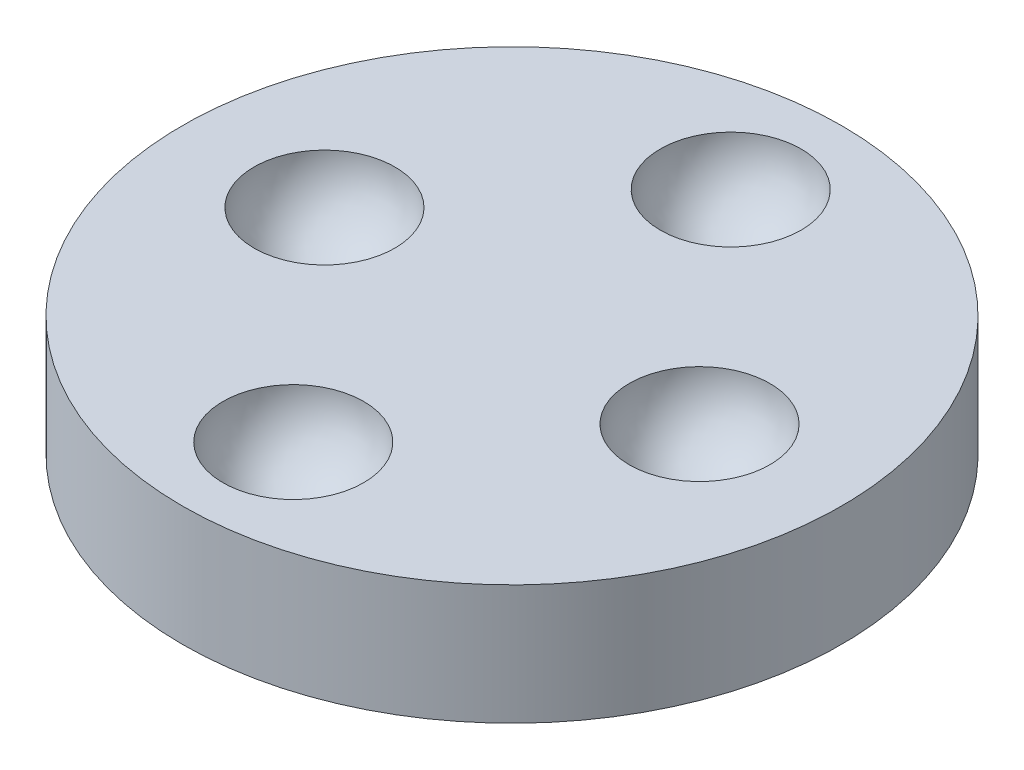
ISO-10303-21;
HEADER;
FILE_DESCRIPTION(('STEP AP214'),'2;1');
FILE_NAME('part.step','',(''),(''),'','','');
FILE_SCHEMA(('AUTOMOTIVE_DESIGN { 1 0 10303 214 1 1 1 1 }'));
ENDSEC;
DATA;
#1=APPLICATION_CONTEXT('core data for automotive mechanical design processes');
#2=APPLICATION_PROTOCOL_DEFINITION('international standard','automotive_design',2000,#1);
#3=PRODUCT_CONTEXT('',#1,'mechanical');
#4=PRODUCT('Part','Part','',(#3));
#5=PRODUCT_RELATED_PRODUCT_CATEGORY('part','',(#4));
#6=PRODUCT_DEFINITION_FORMATION('','',#4);
#7=PRODUCT_DEFINITION_CONTEXT('part definition',#1,'design');
#8=PRODUCT_DEFINITION('design','',#6,#7);
#9=PRODUCT_DEFINITION_SHAPE('','',#8);
#10=(LENGTH_UNIT() NAMED_UNIT(*) SI_UNIT(.MILLI.,.METRE.));
#11=(NAMED_UNIT(*) PLANE_ANGLE_UNIT() SI_UNIT($,.RADIAN.));
#12=(NAMED_UNIT(*) SI_UNIT($,.STERADIAN.) SOLID_ANGLE_UNIT());
#13=UNCERTAINTY_MEASURE_WITH_UNIT(LENGTH_MEASURE(1.E-05),#10,'distance_accuracy_value','');
#14=(GEOMETRIC_REPRESENTATION_CONTEXT(3) GLOBAL_UNCERTAINTY_ASSIGNED_CONTEXT((#13)) GLOBAL_UNIT_ASSIGNED_CONTEXT((#10,
#11,#12)) REPRESENTATION_CONTEXT('',''));
#15=CARTESIAN_POINT('',(0.,0.,0.));
#16=DIRECTION('',(0.,0.,1.));
#17=DIRECTION('',(1.,0.,0.));
#18=AXIS2_PLACEMENT_3D('',#15,#16,#17);
#19=CARTESIAN_POINT('',(0.,5.08,0.));
#20=DIRECTION('',(0.,-1.,0.));
#21=DIRECTION('',(0.,0.,-1.));
#22=AXIS2_PLACEMENT_3D('',#19,#20,#21);
#23=CYLINDRICAL_SURFACE('',#22,13.97);
#24=CARTESIAN_POINT('',(0.,5.08,0.));
#25=DIRECTION('',(0.,1.,0.));
#26=DIRECTION('',(0.,0.,1.));
#27=AXIS2_PLACEMENT_3D('',#24,#25,#26);
#28=CIRCLE('',#27,13.97);
#29=CARTESIAN_POINT('',(0.,5.08,13.97));
#30=VERTEX_POINT('',#29);
#31=EDGE_CURVE('E10',#30,#30,#28,.T.);
#32=ORIENTED_EDGE('',*,*,#31,.F.);
#33=EDGE_LOOP('',(#32));
#34=FACE_BOUND('',#33,.T.);
#35=CARTESIAN_POINT('',(0.,0.,0.));
#36=DIRECTION('',(0.,1.,0.));
#37=DIRECTION('',(0.,0.,1.));
#38=AXIS2_PLACEMENT_3D('',#35,#36,#37);
#39=CIRCLE('',#38,13.97);
#40=CARTESIAN_POINT('',(0.,0.,13.97));
#41=VERTEX_POINT('',#40);
#42=EDGE_CURVE('E45',#41,#41,#39,.T.);
#43=ORIENTED_EDGE('',*,*,#42,.T.);
#44=EDGE_LOOP('',(#43));
#45=FACE_BOUND('',#44,.T.);
#46=ADVANCED_FACE('F42',(#34,#45),#23,.T.);
#47=CARTESIAN_POINT('',(0.,5.08,0.));
#48=DIRECTION('',(0.,1.,0.));
#49=DIRECTION('',(0.,0.,1.));
#50=AXIS2_PLACEMENT_3D('',#47,#48,#49);
#51=PLANE('',#50);
#52=CARTESIAN_POINT('',(0.,5.08,9.271));
#53=DIRECTION('',(0.,-1.,0.));
#54=DIRECTION('',(0.,0.,-1.));
#55=AXIS2_PLACEMENT_3D('',#52,#53,#54);
#56=CIRCLE('',#55,2.9845);
#57=CARTESIAN_POINT('',(0.,5.08,6.2865));
#58=VERTEX_POINT('',#57);
#59=EDGE_CURVE('E67',#58,#58,#56,.T.);
#60=ORIENTED_EDGE('',*,*,#59,.T.);
#61=EDGE_LOOP('',(#60));
#62=FACE_BOUND('',#61,.T.);
#63=CARTESIAN_POINT('',(0.,5.08,-9.271));
#64=DIRECTION('',(0.,1.,0.));
#65=DIRECTION('',(0.,0.,1.));
#66=AXIS2_PLACEMENT_3D('',#63,#64,#65);
#67=CIRCLE('',#66,2.9845);
#68=CARTESIAN_POINT('',(0.,5.08,-6.2865));
#69=VERTEX_POINT('',#68);
#70=EDGE_CURVE('E63',#69,#69,#67,.T.);
#71=ORIENTED_EDGE('',*,*,#70,.F.);
#72=EDGE_LOOP('',(#71));
#73=FACE_BOUND('',#72,.T.);
#74=CARTESIAN_POINT('',(-7.9502,5.08,0.));
#75=DIRECTION('',(0.,-1.,0.));
#76=DIRECTION('',(0.,0.,1.));
#77=AXIS2_PLACEMENT_3D('',#74,#75,#76);
#78=CIRCLE('',#77,2.9845);
#79=CARTESIAN_POINT('',(-7.9502,5.08,2.9845));
#80=VERTEX_POINT('',#79);
#81=EDGE_CURVE('E59',#80,#80,#78,.T.);
#82=ORIENTED_EDGE('',*,*,#81,.T.);
#83=EDGE_LOOP('',(#82));
#84=FACE_BOUND('',#83,.T.);
#85=CARTESIAN_POINT('',(7.9502,5.08,0.));
#86=DIRECTION('',(0.,1.,0.));
#87=DIRECTION('',(0.,0.,1.));
#88=AXIS2_PLACEMENT_3D('',#85,#86,#87);
#89=CIRCLE('',#88,2.9845);
#90=CARTESIAN_POINT('',(7.9502,5.08,2.9845));
#91=VERTEX_POINT('',#90);
#92=EDGE_CURVE('E54',#91,#91,#89,.T.);
#93=ORIENTED_EDGE('',*,*,#92,.F.);
#94=EDGE_LOOP('',(#93));
#95=FACE_BOUND('',#94,.T.);
#96=ORIENTED_EDGE('',*,*,#31,.T.);
#97=EDGE_LOOP('',(#96));
#98=FACE_BOUND('',#97,.T.);
#99=ADVANCED_FACE('F72',(#62,#73,#84,#95,#98),#51,.T.);
#100=CARTESIAN_POINT('',(0.,0.,0.));
#101=DIRECTION('',(0.,1.,0.));
#102=DIRECTION('',(0.,0.,1.));
#103=AXIS2_PLACEMENT_3D('',#100,#101,#102);
#104=PLANE('',#103);
#105=ORIENTED_EDGE('',*,*,#42,.F.);
#106=EDGE_LOOP('',(#105));
#107=FACE_BOUND('',#106,.T.);
#108=ADVANCED_FACE('F91',(#107),#104,.F.);
#109=CARTESIAN_POINT('',(7.9502,5.08,0.));
#110=DIRECTION('',(0.,1.,0.));
#111=DIRECTION('',(0.,0.,1.));
#112=AXIS2_PLACEMENT_3D('',#109,#110,#111);
#113=SPHERICAL_SURFACE('',#112,2.9845);
#114=ORIENTED_EDGE('',*,*,#92,.T.);
#115=EDGE_LOOP('',(#114));
#116=FACE_BOUND('',#115,.T.);
#117=ADVANCED_FACE('F96',(#116),#113,.F.);
#118=CARTESIAN_POINT('',(-7.9502,5.08,0.));
#119=DIRECTION('',(0.,1.,0.));
#120=DIRECTION('',(0.,0.,1.));
#121=AXIS2_PLACEMENT_3D('',#118,#119,#120);
#122=SPHERICAL_SURFACE('',#121,2.9845);
#123=ORIENTED_EDGE('',*,*,#81,.F.);
#124=EDGE_LOOP('',(#123));
#125=FACE_BOUND('',#124,.T.);
#126=ADVANCED_FACE('F83',(#125),#122,.F.);
#127=CARTESIAN_POINT('',(0.,5.08,-9.271));
#128=DIRECTION('',(0.,1.,0.));
#129=DIRECTION('',(1.,0.,0.));
#130=AXIS2_PLACEMENT_3D('',#127,#128,#129);
#131=SPHERICAL_SURFACE('',#130,2.9845);
#132=ORIENTED_EDGE('',*,*,#70,.T.);
#133=EDGE_LOOP('',(#132));
#134=FACE_BOUND('',#133,.T.);
#135=ADVANCED_FACE('F77',(#134),#131,.F.);
#136=CARTESIAN_POINT('',(0.,5.08,9.271));
#137=DIRECTION('',(0.,1.,0.));
#138=DIRECTION('',(1.,0.,0.));
#139=AXIS2_PLACEMENT_3D('',#136,#137,#138);
#140=SPHERICAL_SURFACE('',#139,2.9845);
#141=ORIENTED_EDGE('',*,*,#59,.F.);
#142=EDGE_LOOP('',(#141));
#143=FACE_BOUND('',#142,.T.);
#144=ADVANCED_FACE('F75',(#143),#140,.F.);
#145=CLOSED_SHELL('',(#46,#99,#108,#117,#126,#135,#144));
#146=MANIFOLD_SOLID_BREP('B2',#145);
#147=ADVANCED_BREP_SHAPE_REPRESENTATION('',(#18,#146),#14);
#148=SHAPE_DEFINITION_REPRESENTATION(#9,#147);
ENDSEC;
END-ISO-10303-21;
